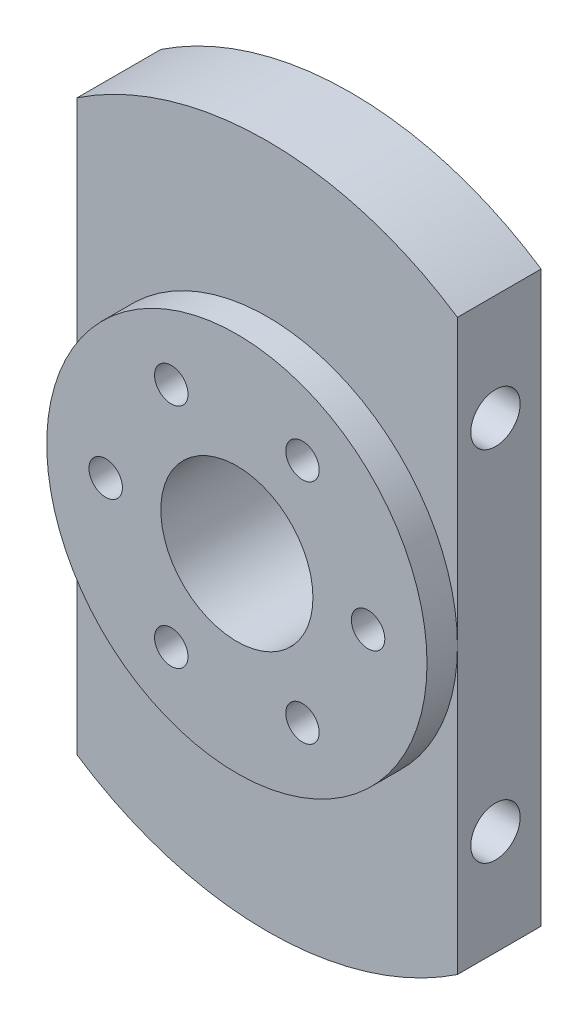
ISO-10303-21;
HEADER;
FILE_DESCRIPTION(('STEP AP214'),'2;1');
FILE_NAME('part.step','',(''),(''),'','','');
FILE_SCHEMA(('AUTOMOTIVE_DESIGN { 1 0 10303 214 1 1 1 1 }'));
ENDSEC;
DATA;
#1=APPLICATION_CONTEXT('core data for automotive mechanical design processes');
#2=APPLICATION_PROTOCOL_DEFINITION('international standard','automotive_design',2000,#1);
#3=PRODUCT_CONTEXT('',#1,'mechanical');
#4=PRODUCT('Part','Part','',(#3));
#5=PRODUCT_RELATED_PRODUCT_CATEGORY('part','',(#4));
#6=PRODUCT_DEFINITION_FORMATION('','',#4);
#7=PRODUCT_DEFINITION_CONTEXT('part definition',#1,'design');
#8=PRODUCT_DEFINITION('design','',#6,#7);
#9=PRODUCT_DEFINITION_SHAPE('','',#8);
#10=(LENGTH_UNIT() NAMED_UNIT(*) SI_UNIT(.MILLI.,.METRE.));
#11=(NAMED_UNIT(*) PLANE_ANGLE_UNIT() SI_UNIT($,.RADIAN.));
#12=(NAMED_UNIT(*) SI_UNIT($,.STERADIAN.) SOLID_ANGLE_UNIT());
#13=UNCERTAINTY_MEASURE_WITH_UNIT(LENGTH_MEASURE(1.E-05),#10,'distance_accuracy_value','');
#14=(GEOMETRIC_REPRESENTATION_CONTEXT(3) GLOBAL_UNCERTAINTY_ASSIGNED_CONTEXT((#13)) GLOBAL_UNIT_ASSIGNED_CONTEXT((#10,
#11,#12)) REPRESENTATION_CONTEXT('',''));
#15=CARTESIAN_POINT('',(0.,0.,0.));
#16=DIRECTION('',(0.,0.,1.));
#17=DIRECTION('',(1.,0.,0.));
#18=AXIS2_PLACEMENT_3D('',#15,#16,#17);
#19=CARTESIAN_POINT('',(0.,0.,15.));
#20=DIRECTION('',(0.,0.,1.));
#21=DIRECTION('',(1.,0.,0.));
#22=AXIS2_PLACEMENT_3D('',#19,#20,#21);
#23=PLANE('',#22);
#24=CARTESIAN_POINT('',(17.25,0.,15.));
#25=DIRECTION('',(0.,0.,1.));
#26=DIRECTION('',(1.,0.,0.));
#27=AXIS2_PLACEMENT_3D('',#24,#25,#26);
#28=CIRCLE('',#27,2.2);
#29=CARTESIAN_POINT('',(19.45,0.,15.));
#30=VERTEX_POINT('',#29);
#31=EDGE_CURVE('E216',#30,#30,#28,.T.);
#32=ORIENTED_EDGE('',*,*,#31,.F.);
#33=EDGE_LOOP('',(#32));
#34=FACE_BOUND('',#33,.T.);
#35=CARTESIAN_POINT('',(8.62500000000017,14.9389382152815,15.));
#36=DIRECTION('',(0.,0.,1.));
#37=DIRECTION('',(1.,0.,0.));
#38=AXIS2_PLACEMENT_3D('',#35,#36,#37);
#39=CIRCLE('',#38,2.2);
#40=CARTESIAN_POINT('',(10.8250000000002,14.9389382152815,15.));
#41=VERTEX_POINT('',#40);
#42=EDGE_CURVE('E206',#41,#41,#39,.T.);
#43=ORIENTED_EDGE('',*,*,#42,.F.);
#44=EDGE_LOOP('',(#43));
#45=FACE_BOUND('',#44,.T.);
#46=CARTESIAN_POINT('',(-8.62499999999986,14.9389382152816,15.));
#47=DIRECTION('',(0.,0.,1.));
#48=DIRECTION('',(1.,0.,0.));
#49=AXIS2_PLACEMENT_3D('',#46,#47,#48);
#50=CIRCLE('',#49,2.2);
#51=CARTESIAN_POINT('',(-6.42499999999986,14.9389382152816,15.));
#52=VERTEX_POINT('',#51);
#53=EDGE_CURVE('E225',#52,#52,#50,.T.);
#54=ORIENTED_EDGE('',*,*,#53,.F.);
#55=EDGE_LOOP('',(#54));
#56=FACE_BOUND('',#55,.T.);
#57=CARTESIAN_POINT('',(-17.25,1.20456106190088E-13,15.));
#58=DIRECTION('',(0.,0.,1.));
#59=DIRECTION('',(1.,0.,0.));
#60=AXIS2_PLACEMENT_3D('',#57,#58,#59);
#61=CIRCLE('',#60,2.2);
#62=CARTESIAN_POINT('',(-15.05,1.20456106190088E-13,15.));
#63=VERTEX_POINT('',#62);
#64=EDGE_CURVE('E233',#63,#63,#61,.T.);
#65=ORIENTED_EDGE('',*,*,#64,.F.);
#66=EDGE_LOOP('',(#65));
#67=FACE_BOUND('',#66,.T.);
#68=CARTESIAN_POINT('',(-8.62500000000007,-14.9389382152815,15.));
#69=DIRECTION('',(0.,0.,1.));
#70=DIRECTION('',(1.,0.,0.));
#71=AXIS2_PLACEMENT_3D('',#68,#69,#70);
#72=CIRCLE('',#71,2.2);
#73=CARTESIAN_POINT('',(-6.42500000000007,-14.9389382152815,15.));
#74=VERTEX_POINT('',#73);
#75=EDGE_CURVE('E229',#74,#74,#72,.T.);
#76=ORIENTED_EDGE('',*,*,#75,.F.);
#77=EDGE_LOOP('',(#76));
#78=FACE_BOUND('',#77,.T.);
#79=CARTESIAN_POINT('',(8.62499999999997,-14.9389382152816,15.));
#80=DIRECTION('',(0.,0.,1.));
#81=DIRECTION('',(1.,0.,0.));
#82=AXIS2_PLACEMENT_3D('',#79,#80,#81);
#83=CIRCLE('',#82,2.2);
#84=CARTESIAN_POINT('',(10.825,-14.9389382152816,15.));
#85=VERTEX_POINT('',#84);
#86=EDGE_CURVE('E221',#85,#85,#83,.T.);
#87=ORIENTED_EDGE('',*,*,#86,.F.);
#88=EDGE_LOOP('',(#87));
#89=FACE_BOUND('',#88,.T.);
#90=CARTESIAN_POINT('',(0.,0.,15.));
#91=DIRECTION('',(0.,0.,1.));
#92=DIRECTION('',(1.,0.,0.));
#93=AXIS2_PLACEMENT_3D('',#90,#91,#92);
#94=CIRCLE('',#93,10.);
#95=CARTESIAN_POINT('',(10.,0.,15.));
#96=VERTEX_POINT('',#95);
#97=EDGE_CURVE('E220',#96,#96,#94,.T.);
#98=ORIENTED_EDGE('',*,*,#97,.F.);
#99=EDGE_LOOP('',(#98));
#100=FACE_BOUND('',#99,.T.);
#101=CARTESIAN_POINT('',(0.,0.,15.));
#102=DIRECTION('',(0.,0.,1.));
#103=DIRECTION('',(1.,0.,0.));
#104=AXIS2_PLACEMENT_3D('',#101,#102,#103);
#105=CIRCLE('',#104,25.);
#106=CARTESIAN_POINT('',(25.,0.,15.));
#107=VERTEX_POINT('',#106);
#108=EDGE_CURVE('E120',#107,#107,#105,.T.);
#109=ORIENTED_EDGE('',*,*,#108,.T.);
#110=EDGE_LOOP('',(#109));
#111=FACE_BOUND('',#110,.T.);
#112=ADVANCED_FACE('F43',(#34,#45,#56,#67,#78,#89,#100,#111),#23,.T.);
#113=CARTESIAN_POINT('',(25.,0.,0.));
#114=DIRECTION('',(1.,0.,0.));
#115=DIRECTION('',(0.,0.,-1.));
#116=AXIS2_PLACEMENT_3D('',#113,#114,#115);
#117=PLANE('',#116);
#118=CARTESIAN_POINT('',(25.,23.45,6.00000000000001));
#119=DIRECTION('',(1.,0.,0.));
#120=DIRECTION('',(0.,0.,-1.));
#121=AXIS2_PLACEMENT_3D('',#118,#119,#120);
#122=CIRCLE('',#121,3.25);
#123=CARTESIAN_POINT('',(25.,23.45,2.75000000000001));
#124=VERTEX_POINT('',#123);
#125=EDGE_CURVE('E186',#124,#124,#122,.T.);
#126=ORIENTED_EDGE('',*,*,#125,.F.);
#127=EDGE_LOOP('',(#126));
#128=FACE_BOUND('',#127,.T.);
#129=CARTESIAN_POINT('',(25.,-23.63,6.));
#130=DIRECTION('',(1.,0.,0.));
#131=DIRECTION('',(0.,0.,-1.));
#132=AXIS2_PLACEMENT_3D('',#129,#130,#131);
#133=CIRCLE('',#132,3.25);
#134=CARTESIAN_POINT('',(25.,-23.63,2.75));
#135=VERTEX_POINT('',#134);
#136=EDGE_CURVE('E190',#135,#135,#133,.T.);
#137=ORIENTED_EDGE('',*,*,#136,.F.);
#138=EDGE_LOOP('',(#137));
#139=FACE_BOUND('',#138,.T.);
#140=DIRECTION('',(0.,1.,0.));
#141=VECTOR('',#140,1.);
#142=CARTESIAN_POINT('',(25.,0.,11.));
#143=LINE('',#142,#141);
#144=CARTESIAN_POINT('',(25.,0.,11.));
#145=VERTEX_POINT('',#144);
#146=CARTESIAN_POINT('',(25.,37.4165738677394,11.));
#147=VERTEX_POINT('',#146);
#148=EDGE_CURVE('E119',#145,#147,#143,.T.);
#149=ORIENTED_EDGE('',*,*,#148,.F.);
#150=DIRECTION('',(0.,1.,0.));
#151=VECTOR('',#150,1.);
#152=CARTESIAN_POINT('',(25.,0.,11.));
#153=LINE('',#152,#151);
#154=CARTESIAN_POINT('',(25.,-37.4165738677394,11.));
#155=VERTEX_POINT('',#154);
#156=EDGE_CURVE('E99',#155,#145,#153,.T.);
#157=ORIENTED_EDGE('',*,*,#156,.F.);
#158=DIRECTION('',(0.,0.,1.));
#159=VECTOR('',#158,1.);
#160=CARTESIAN_POINT('',(25.,-37.4165738677394,0.));
#161=LINE('',#160,#159);
#162=CARTESIAN_POINT('',(25.,-37.4165738677394,0.));
#163=VERTEX_POINT('',#162);
#164=EDGE_CURVE('E69',#163,#155,#161,.T.);
#165=ORIENTED_EDGE('',*,*,#164,.F.);
#166=DIRECTION('',(0.,1.,0.));
#167=VECTOR('',#166,1.);
#168=CARTESIAN_POINT('',(25.,0.,0.));
#169=LINE('',#168,#167);
#170=CARTESIAN_POINT('',(25.,37.4165738677394,0.));
#171=VERTEX_POINT('',#170);
#172=EDGE_CURVE('E185',#163,#171,#169,.T.);
#173=ORIENTED_EDGE('',*,*,#172,.T.);
#174=DIRECTION('',(0.,0.,1.));
#175=VECTOR('',#174,1.);
#176=CARTESIAN_POINT('',(25.,37.4165738677394,0.));
#177=LINE('',#176,#175);
#178=EDGE_CURVE('E202',#171,#147,#177,.T.);
#179=ORIENTED_EDGE('',*,*,#178,.T.);
#180=EDGE_LOOP('',(#149,#157,#165,#173,#179));
#181=FACE_BOUND('',#180,.T.);
#182=ADVANCED_FACE('F288',(#128,#139,#181),#117,.T.);
#183=CARTESIAN_POINT('',(-25.,0.,0.));
#184=DIRECTION('',(1.,0.,0.));
#185=DIRECTION('',(0.,0.,-1.));
#186=AXIS2_PLACEMENT_3D('',#183,#184,#185);
#187=PLANE('',#186);
#188=CARTESIAN_POINT('',(-25.,23.45,6.00000000000001));
#189=DIRECTION('',(1.,0.,0.));
#190=DIRECTION('',(0.,0.,-1.));
#191=AXIS2_PLACEMENT_3D('',#188,#189,#190);
#192=CIRCLE('',#191,3.25);
#193=CARTESIAN_POINT('',(-25.,23.45,2.75000000000001));
#194=VERTEX_POINT('',#193);
#195=EDGE_CURVE('E181',#194,#194,#192,.T.);
#196=ORIENTED_EDGE('',*,*,#195,.T.);
#197=EDGE_LOOP('',(#196));
#198=FACE_BOUND('',#197,.T.);
#199=CARTESIAN_POINT('',(-25.,-23.63,6.));
#200=DIRECTION('',(1.,0.,0.));
#201=DIRECTION('',(0.,0.,-1.));
#202=AXIS2_PLACEMENT_3D('',#199,#200,#201);
#203=CIRCLE('',#202,3.25);
#204=CARTESIAN_POINT('',(-25.,-23.63,2.75));
#205=VERTEX_POINT('',#204);
#206=EDGE_CURVE('E194',#205,#205,#203,.T.);
#207=ORIENTED_EDGE('',*,*,#206,.T.);
#208=EDGE_LOOP('',(#207));
#209=FACE_BOUND('',#208,.T.);
#210=DIRECTION('',(0.,-1.,0.));
#211=VECTOR('',#210,1.);
#212=CARTESIAN_POINT('',(-25.,0.,11.));
#213=LINE('',#212,#211);
#214=CARTESIAN_POINT('',(-25.,0.,11.));
#215=VERTEX_POINT('',#214);
#216=CARTESIAN_POINT('',(-25.,-37.4165738677394,11.));
#217=VERTEX_POINT('',#216);
#218=EDGE_CURVE('E97',#215,#217,#213,.T.);
#219=ORIENTED_EDGE('',*,*,#218,.F.);
#220=DIRECTION('',(0.,-1.,0.));
#221=VECTOR('',#220,1.);
#222=CARTESIAN_POINT('',(-25.,0.,11.));
#223=LINE('',#222,#221);
#224=CARTESIAN_POINT('',(-25.,37.4165738677394,11.));
#225=VERTEX_POINT('',#224);
#226=EDGE_CURVE('E108',#225,#215,#223,.T.);
#227=ORIENTED_EDGE('',*,*,#226,.F.);
#228=DIRECTION('',(0.,0.,1.));
#229=VECTOR('',#228,1.);
#230=CARTESIAN_POINT('',(-25.,37.4165738677394,0.));
#231=LINE('',#230,#229);
#232=CARTESIAN_POINT('',(-25.,37.4165738677394,0.));
#233=VERTEX_POINT('',#232);
#234=EDGE_CURVE('E203',#233,#225,#231,.T.);
#235=ORIENTED_EDGE('',*,*,#234,.F.);
#236=DIRECTION('',(0.,1.,0.));
#237=VECTOR('',#236,1.);
#238=CARTESIAN_POINT('',(-25.,0.,0.));
#239=LINE('',#238,#237);
#240=CARTESIAN_POINT('',(-25.,-37.4165738677394,0.));
#241=VERTEX_POINT('',#240);
#242=EDGE_CURVE('E198',#241,#233,#239,.T.);
#243=ORIENTED_EDGE('',*,*,#242,.F.);
#244=DIRECTION('',(0.,0.,1.));
#245=VECTOR('',#244,1.);
#246=CARTESIAN_POINT('',(-25.,-37.4165738677394,0.));
#247=LINE('',#246,#245);
#248=EDGE_CURVE('E111',#241,#217,#247,.T.);
#249=ORIENTED_EDGE('',*,*,#248,.T.);
#250=EDGE_LOOP('',(#219,#227,#235,#243,#249));
#251=FACE_BOUND('',#250,.T.);
#252=ADVANCED_FACE('F107',(#198,#209,#251),#187,.F.);
#253=CARTESIAN_POINT('',(0.,0.,15.));
#254=DIRECTION('',(0.,0.,-1.));
#255=DIRECTION('',(-1.,0.,0.));
#256=AXIS2_PLACEMENT_3D('',#253,#254,#255);
#257=CYLINDRICAL_SURFACE('',#256,45.);
#258=CARTESIAN_POINT('',(0.,0.,11.));
#259=DIRECTION('',(0.,0.,1.));
#260=DIRECTION('',(1.,0.,0.));
#261=AXIS2_PLACEMENT_3D('',#258,#259,#260);
#262=CIRCLE('',#261,45.);
#263=EDGE_CURVE('E113',#217,#155,#262,.T.);
#264=ORIENTED_EDGE('',*,*,#263,.F.);
#265=ORIENTED_EDGE('',*,*,#248,.F.);
#266=CARTESIAN_POINT('',(0.,0.,0.));
#267=DIRECTION('',(0.,0.,1.));
#268=DIRECTION('',(1.,0.,0.));
#269=AXIS2_PLACEMENT_3D('',#266,#267,#268);
#270=CIRCLE('',#269,45.);
#271=EDGE_CURVE('E53',#241,#163,#270,.T.);
#272=ORIENTED_EDGE('',*,*,#271,.T.);
#273=ORIENTED_EDGE('',*,*,#164,.T.);
#274=EDGE_LOOP('',(#264,#265,#272,#273));
#275=FACE_BOUND('',#274,.T.);
#276=ADVANCED_FACE('F45',(#275),#257,.T.);
#277=CARTESIAN_POINT('',(0.,0.,11.));
#278=DIRECTION('',(0.,0.,1.));
#279=DIRECTION('',(1.,0.,0.));
#280=AXIS2_PLACEMENT_3D('',#277,#278,#279);
#281=CIRCLE('',#280,45.);
#282=EDGE_CURVE('E61',#147,#225,#281,.T.);
#283=ORIENTED_EDGE('',*,*,#282,.F.);
#284=ORIENTED_EDGE('',*,*,#178,.F.);
#285=EDGE_CURVE('E11',#171,#233,#270,.T.);
#286=ORIENTED_EDGE('',*,*,#285,.T.);
#287=ORIENTED_EDGE('',*,*,#234,.T.);
#288=EDGE_LOOP('',(#283,#284,#286,#287));
#289=FACE_BOUND('',#288,.T.);
#290=ADVANCED_FACE('F275',(#289),#257,.T.);
#291=CARTESIAN_POINT('',(8.62499999999997,-14.9389382152816,0.));
#292=DIRECTION('',(0.,0.,1.));
#293=DIRECTION('',(1.,0.,0.));
#294=AXIS2_PLACEMENT_3D('',#291,#292,#293);
#295=CYLINDRICAL_SURFACE('',#294,2.2);
#296=ORIENTED_EDGE('',*,*,#86,.T.);
#297=EDGE_LOOP('',(#296));
#298=FACE_BOUND('',#297,.T.);
#299=CARTESIAN_POINT('',(8.62499999999997,-14.9389382152816,9.));
#300=DIRECTION('',(0.,0.,-1.));
#301=DIRECTION('',(-1.,0.,0.));
#302=AXIS2_PLACEMENT_3D('',#299,#300,#301);
#303=CIRCLE('',#302,2.2);
#304=CARTESIAN_POINT('',(6.42499999999997,-14.9389382152816,9.));
#305=VERTEX_POINT('',#304);
#306=EDGE_CURVE('E47',#305,#305,#303,.F.);
#307=ORIENTED_EDGE('',*,*,#306,.F.);
#308=EDGE_LOOP('',(#307));
#309=FACE_BOUND('',#308,.T.);
#310=ADVANCED_FACE('F272',(#298,#309),#295,.F.);
#311=CARTESIAN_POINT('',(-8.62500000000007,-14.9389382152815,0.));
#312=DIRECTION('',(0.,0.,1.));
#313=DIRECTION('',(1.,0.,0.));
#314=AXIS2_PLACEMENT_3D('',#311,#312,#313);
#315=CYLINDRICAL_SURFACE('',#314,2.2);
#316=ORIENTED_EDGE('',*,*,#75,.T.);
#317=EDGE_LOOP('',(#316));
#318=FACE_BOUND('',#317,.T.);
#319=CARTESIAN_POINT('',(-8.62500000000007,-14.9389382152815,9.));
#320=DIRECTION('',(0.,0.,-1.));
#321=DIRECTION('',(-1.,0.,0.));
#322=AXIS2_PLACEMENT_3D('',#319,#320,#321);
#323=CIRCLE('',#322,2.2);
#324=CARTESIAN_POINT('',(-10.8250000000001,-14.9389382152815,9.));
#325=VERTEX_POINT('',#324);
#326=EDGE_CURVE('E261',#325,#325,#323,.F.);
#327=ORIENTED_EDGE('',*,*,#326,.F.);
#328=EDGE_LOOP('',(#327));
#329=FACE_BOUND('',#328,.T.);
#330=ADVANCED_FACE('F274',(#318,#329),#315,.F.);
#331=CARTESIAN_POINT('',(-17.25,1.20456106190088E-13,0.));
#332=DIRECTION('',(0.,0.,1.));
#333=DIRECTION('',(1.,0.,0.));
#334=AXIS2_PLACEMENT_3D('',#331,#332,#333);
#335=CYLINDRICAL_SURFACE('',#334,2.2);
#336=ORIENTED_EDGE('',*,*,#64,.T.);
#337=EDGE_LOOP('',(#336));
#338=FACE_BOUND('',#337,.T.);
#339=CARTESIAN_POINT('',(-17.25,1.20456106190088E-13,9.));
#340=DIRECTION('',(0.,0.,-1.));
#341=DIRECTION('',(-1.,0.,0.));
#342=AXIS2_PLACEMENT_3D('',#339,#340,#341);
#343=CIRCLE('',#342,2.2);
#344=CARTESIAN_POINT('',(-19.45,1.20456106190088E-13,9.));
#345=VERTEX_POINT('',#344);
#346=EDGE_CURVE('E258',#345,#345,#343,.F.);
#347=ORIENTED_EDGE('',*,*,#346,.F.);
#348=EDGE_LOOP('',(#347));
#349=FACE_BOUND('',#348,.T.);
#350=ADVANCED_FACE('F282',(#338,#349),#335,.F.);
#351=CARTESIAN_POINT('',(-8.62499999999986,14.9389382152816,0.));
#352=DIRECTION('',(0.,0.,1.));
#353=DIRECTION('',(1.,0.,0.));
#354=AXIS2_PLACEMENT_3D('',#351,#352,#353);
#355=CYLINDRICAL_SURFACE('',#354,2.2);
#356=ORIENTED_EDGE('',*,*,#53,.T.);
#357=EDGE_LOOP('',(#356));
#358=FACE_BOUND('',#357,.T.);
#359=CARTESIAN_POINT('',(-8.62499999999986,14.9389382152816,9.));
#360=DIRECTION('',(0.,0.,-1.));
#361=DIRECTION('',(-1.,0.,0.));
#362=AXIS2_PLACEMENT_3D('',#359,#360,#361);
#363=CIRCLE('',#362,2.2);
#364=CARTESIAN_POINT('',(-10.8249999999999,14.9389382152816,9.));
#365=VERTEX_POINT('',#364);
#366=EDGE_CURVE('E254',#365,#365,#363,.F.);
#367=ORIENTED_EDGE('',*,*,#366,.F.);
#368=EDGE_LOOP('',(#367));
#369=FACE_BOUND('',#368,.T.);
#370=ADVANCED_FACE('F351',(#358,#369),#355,.F.);
#371=CARTESIAN_POINT('',(8.62500000000017,14.9389382152815,0.));
#372=DIRECTION('',(0.,0.,1.));
#373=DIRECTION('',(1.,0.,0.));
#374=AXIS2_PLACEMENT_3D('',#371,#372,#373);
#375=CYLINDRICAL_SURFACE('',#374,2.2);
#376=ORIENTED_EDGE('',*,*,#42,.T.);
#377=EDGE_LOOP('',(#376));
#378=FACE_BOUND('',#377,.T.);
#379=CARTESIAN_POINT('',(8.62500000000017,14.9389382152815,9.));
#380=DIRECTION('',(0.,0.,-1.));
#381=DIRECTION('',(-1.,0.,0.));
#382=AXIS2_PLACEMENT_3D('',#379,#380,#381);
#383=CIRCLE('',#382,2.2);
#384=CARTESIAN_POINT('',(6.42500000000017,14.9389382152815,9.));
#385=VERTEX_POINT('',#384);
#386=EDGE_CURVE('E250',#385,#385,#383,.F.);
#387=ORIENTED_EDGE('',*,*,#386,.F.);
#388=EDGE_LOOP('',(#387));
#389=FACE_BOUND('',#388,.T.);
#390=ADVANCED_FACE('F311',(#378,#389),#375,.F.);
#391=CARTESIAN_POINT('',(17.25,0.,0.));
#392=DIRECTION('',(0.,0.,1.));
#393=DIRECTION('',(1.,0.,0.));
#394=AXIS2_PLACEMENT_3D('',#391,#392,#393);
#395=CYLINDRICAL_SURFACE('',#394,2.2);
#396=ORIENTED_EDGE('',*,*,#31,.T.);
#397=EDGE_LOOP('',(#396));
#398=FACE_BOUND('',#397,.T.);
#399=CARTESIAN_POINT('',(17.25,0.,9.));
#400=DIRECTION('',(0.,0.,-1.));
#401=DIRECTION('',(-1.,0.,0.));
#402=AXIS2_PLACEMENT_3D('',#399,#400,#401);
#403=CIRCLE('',#402,2.2);
#404=CARTESIAN_POINT('',(15.05,0.,9.));
#405=VERTEX_POINT('',#404);
#406=EDGE_CURVE('E141',#405,#405,#403,.F.);
#407=ORIENTED_EDGE('',*,*,#406,.F.);
#408=EDGE_LOOP('',(#407));
#409=FACE_BOUND('',#408,.T.);
#410=ADVANCED_FACE('F303',(#398,#409),#395,.F.);
#411=CARTESIAN_POINT('',(0.,0.,0.));
#412=DIRECTION('',(0.,0.,1.));
#413=DIRECTION('',(1.,0.,0.));
#414=AXIS2_PLACEMENT_3D('',#411,#412,#413);
#415=PLANE('',#414);
#416=CARTESIAN_POINT('',(17.25,0.,0.));
#417=DIRECTION('',(0.,0.,-1.));
#418=DIRECTION('',(-1.,0.,0.));
#419=AXIS2_PLACEMENT_3D('',#416,#417,#418);
#420=CIRCLE('',#419,4.);
#421=CARTESIAN_POINT('',(13.25,0.,0.));
#422=VERTEX_POINT('',#421);
#423=EDGE_CURVE('E142',#422,#422,#420,.T.);
#424=ORIENTED_EDGE('',*,*,#423,.F.);
#425=EDGE_LOOP('',(#424));
#426=FACE_BOUND('',#425,.T.);
#427=CARTESIAN_POINT('',(-8.62499999999986,14.9389382152816,0.));
#428=DIRECTION('',(0.,0.,-1.));
#429=DIRECTION('',(-1.,0.,0.));
#430=AXIS2_PLACEMENT_3D('',#427,#428,#429);
#431=CIRCLE('',#430,4.);
#432=CARTESIAN_POINT('',(-12.6249999999999,14.9389382152816,0.));
#433=VERTEX_POINT('',#432);
#434=EDGE_CURVE('E129',#433,#433,#431,.T.);
#435=ORIENTED_EDGE('',*,*,#434,.F.);
#436=EDGE_LOOP('',(#435));
#437=FACE_BOUND('',#436,.T.);
#438=CARTESIAN_POINT('',(-17.25,1.20456106190088E-13,0.));
#439=DIRECTION('',(0.,0.,-1.));
#440=DIRECTION('',(-1.,0.,0.));
#441=AXIS2_PLACEMENT_3D('',#438,#439,#440);
#442=CIRCLE('',#441,4.);
#443=CARTESIAN_POINT('',(-21.25,1.20456106190088E-13,0.));
#444=VERTEX_POINT('',#443);
#445=EDGE_CURVE('E174',#444,#444,#442,.T.);
#446=ORIENTED_EDGE('',*,*,#445,.F.);
#447=EDGE_LOOP('',(#446));
#448=FACE_BOUND('',#447,.T.);
#449=CARTESIAN_POINT('',(-8.62500000000007,-14.9389382152815,0.));
#450=DIRECTION('',(0.,0.,-1.));
#451=DIRECTION('',(-1.,0.,0.));
#452=AXIS2_PLACEMENT_3D('',#449,#450,#451);
#453=CIRCLE('',#452,4.);
#454=CARTESIAN_POINT('',(-12.6250000000001,-14.9389382152815,0.));
#455=VERTEX_POINT('',#454);
#456=EDGE_CURVE('E166',#455,#455,#453,.T.);
#457=ORIENTED_EDGE('',*,*,#456,.F.);
#458=EDGE_LOOP('',(#457));
#459=FACE_BOUND('',#458,.T.);
#460=CARTESIAN_POINT('',(8.62499999999997,-14.9389382152816,0.));
#461=DIRECTION('',(0.,0.,-1.));
#462=DIRECTION('',(-1.,0.,0.));
#463=AXIS2_PLACEMENT_3D('',#460,#461,#462);
#464=CIRCLE('',#463,4.);
#465=CARTESIAN_POINT('',(4.62499999999997,-14.9389382152816,0.));
#466=VERTEX_POINT('',#465);
#467=EDGE_CURVE('E158',#466,#466,#464,.T.);
#468=ORIENTED_EDGE('',*,*,#467,.F.);
#469=EDGE_LOOP('',(#468));
#470=FACE_BOUND('',#469,.T.);
#471=CARTESIAN_POINT('',(8.62500000000017,14.9389382152815,0.));
#472=DIRECTION('',(0.,0.,-1.));
#473=DIRECTION('',(-1.,0.,0.));
#474=AXIS2_PLACEMENT_3D('',#471,#472,#473);
#475=CIRCLE('',#474,4.);
#476=CARTESIAN_POINT('',(4.62500000000017,14.9389382152815,0.));
#477=VERTEX_POINT('',#476);
#478=EDGE_CURVE('E146',#477,#477,#475,.T.);
#479=ORIENTED_EDGE('',*,*,#478,.F.);
#480=EDGE_LOOP('',(#479));
#481=FACE_BOUND('',#480,.T.);
#482=CARTESIAN_POINT('',(0.,0.,0.));
#483=DIRECTION('',(0.,0.,1.));
#484=DIRECTION('',(1.,0.,0.));
#485=AXIS2_PLACEMENT_3D('',#482,#483,#484);
#486=CIRCLE('',#485,10.);
#487=CARTESIAN_POINT('',(10.,0.,0.));
#488=VERTEX_POINT('',#487);
#489=EDGE_CURVE('E242',#488,#488,#486,.T.);
#490=ORIENTED_EDGE('',*,*,#489,.T.);
#491=EDGE_LOOP('',(#490));
#492=FACE_BOUND('',#491,.T.);
#493=ORIENTED_EDGE('',*,*,#271,.F.);
#494=ORIENTED_EDGE('',*,*,#242,.T.);
#495=ORIENTED_EDGE('',*,*,#285,.F.);
#496=ORIENTED_EDGE('',*,*,#172,.F.);
#497=EDGE_LOOP('',(#493,#494,#495,#496));
#498=FACE_BOUND('',#497,.T.);
#499=ADVANCED_FACE('F301',(#426,#437,#448,#459,#470,#481,#492,#498),#415,.F.);
#500=CARTESIAN_POINT('',(0.,0.,-11.));
#501=DIRECTION('',(0.,0.,1.));
#502=DIRECTION('',(1.,0.,0.));
#503=AXIS2_PLACEMENT_3D('',#500,#501,#502);
#504=CYLINDRICAL_SURFACE('',#503,10.);
#505=ORIENTED_EDGE('',*,*,#97,.T.);
#506=EDGE_LOOP('',(#505));
#507=FACE_BOUND('',#506,.T.);
#508=ORIENTED_EDGE('',*,*,#489,.F.);
#509=EDGE_LOOP('',(#508));
#510=FACE_BOUND('',#509,.T.);
#511=ADVANCED_FACE('F299',(#507,#510),#504,.F.);
#512=CARTESIAN_POINT('',(-25.,-23.63,6.));
#513=DIRECTION('',(1.,0.,0.));
#514=DIRECTION('',(0.,0.,-1.));
#515=AXIS2_PLACEMENT_3D('',#512,#513,#514);
#516=CYLINDRICAL_SURFACE('',#515,3.25);
#517=ORIENTED_EDGE('',*,*,#206,.F.);
#518=EDGE_LOOP('',(#517));
#519=FACE_BOUND('',#518,.T.);
#520=ORIENTED_EDGE('',*,*,#136,.T.);
#521=EDGE_LOOP('',(#520));
#522=FACE_BOUND('',#521,.T.);
#523=ADVANCED_FACE('F309',(#519,#522),#516,.F.);
#524=CARTESIAN_POINT('',(-25.,23.45,6.00000000000001));
#525=DIRECTION('',(1.,0.,0.));
#526=DIRECTION('',(0.,0.,-1.));
#527=AXIS2_PLACEMENT_3D('',#524,#525,#526);
#528=CYLINDRICAL_SURFACE('',#527,3.25);
#529=ORIENTED_EDGE('',*,*,#195,.F.);
#530=EDGE_LOOP('',(#529));
#531=FACE_BOUND('',#530,.T.);
#532=ORIENTED_EDGE('',*,*,#125,.T.);
#533=EDGE_LOOP('',(#532));
#534=FACE_BOUND('',#533,.T.);
#535=ADVANCED_FACE('F402',(#531,#534),#528,.F.);
#536=CARTESIAN_POINT('',(17.25,0.,9.));
#537=DIRECTION('',(0.,0.,-1.));
#538=DIRECTION('',(-1.,0.,0.));
#539=AXIS2_PLACEMENT_3D('',#536,#537,#538);
#540=PLANE('',#539);
#541=CARTESIAN_POINT('',(17.25,0.,9.));
#542=DIRECTION('',(0.,0.,-1.));
#543=DIRECTION('',(-1.,0.,0.));
#544=AXIS2_PLACEMENT_3D('',#541,#542,#543);
#545=CIRCLE('',#544,4.);
#546=CARTESIAN_POINT('',(13.25,0.,9.));
#547=VERTEX_POINT('',#546);
#548=EDGE_CURVE('E137',#547,#547,#545,.T.);
#549=ORIENTED_EDGE('',*,*,#548,.T.);
#550=EDGE_LOOP('',(#549));
#551=FACE_BOUND('',#550,.T.);
#552=ORIENTED_EDGE('',*,*,#406,.T.);
#553=EDGE_LOOP('',(#552));
#554=FACE_BOUND('',#553,.T.);
#555=ADVANCED_FACE('F374',(#551,#554),#540,.T.);
#556=CARTESIAN_POINT('',(17.25,0.,9.));
#557=DIRECTION('',(0.,0.,-1.));
#558=DIRECTION('',(-1.,0.,0.));
#559=AXIS2_PLACEMENT_3D('',#556,#557,#558);
#560=CYLINDRICAL_SURFACE('',#559,4.);
#561=ORIENTED_EDGE('',*,*,#548,.F.);
#562=EDGE_LOOP('',(#561));
#563=FACE_BOUND('',#562,.T.);
#564=ORIENTED_EDGE('',*,*,#423,.T.);
#565=EDGE_LOOP('',(#564));
#566=FACE_BOUND('',#565,.T.);
#567=ADVANCED_FACE('F364',(#563,#566),#560,.F.);
#568=CARTESIAN_POINT('',(8.62500000000017,14.9389382152815,9.));
#569=DIRECTION('',(0.,0.,-1.));
#570=DIRECTION('',(-1.,0.,0.));
#571=AXIS2_PLACEMENT_3D('',#568,#569,#570);
#572=PLANE('',#571);
#573=CARTESIAN_POINT('',(8.62500000000017,14.9389382152815,9.));
#574=DIRECTION('',(0.,0.,-1.));
#575=DIRECTION('',(-1.,0.,0.));
#576=AXIS2_PLACEMENT_3D('',#573,#574,#575);
#577=CIRCLE('',#576,4.);
#578=CARTESIAN_POINT('',(4.62500000000017,14.9389382152815,9.));
#579=VERTEX_POINT('',#578);
#580=EDGE_CURVE('E154',#579,#579,#577,.T.);
#581=ORIENTED_EDGE('',*,*,#580,.T.);
#582=EDGE_LOOP('',(#581));
#583=FACE_BOUND('',#582,.T.);
#584=ORIENTED_EDGE('',*,*,#386,.T.);
#585=EDGE_LOOP('',(#584));
#586=FACE_BOUND('',#585,.T.);
#587=ADVANCED_FACE('F361',(#583,#586),#572,.T.);
#588=CARTESIAN_POINT('',(8.62500000000017,14.9389382152815,9.));
#589=DIRECTION('',(0.,0.,-1.));
#590=DIRECTION('',(-1.,0.,0.));
#591=AXIS2_PLACEMENT_3D('',#588,#589,#590);
#592=CYLINDRICAL_SURFACE('',#591,4.);
#593=ORIENTED_EDGE('',*,*,#580,.F.);
#594=EDGE_LOOP('',(#593));
#595=FACE_BOUND('',#594,.T.);
#596=ORIENTED_EDGE('',*,*,#478,.T.);
#597=EDGE_LOOP('',(#596));
#598=FACE_BOUND('',#597,.T.);
#599=ADVANCED_FACE('F363',(#595,#598),#592,.F.);
#600=CARTESIAN_POINT('',(-8.62499999999986,14.9389382152816,9.));
#601=DIRECTION('',(0.,0.,-1.));
#602=DIRECTION('',(-1.,0.,0.));
#603=AXIS2_PLACEMENT_3D('',#600,#601,#602);
#604=PLANE('',#603);
#605=CARTESIAN_POINT('',(-8.62499999999986,14.9389382152816,9.));
#606=DIRECTION('',(0.,0.,-1.));
#607=DIRECTION('',(-1.,0.,0.));
#608=AXIS2_PLACEMENT_3D('',#605,#606,#607);
#609=CIRCLE('',#608,4.);
#610=CARTESIAN_POINT('',(-12.6249999999999,14.9389382152816,9.));
#611=VERTEX_POINT('',#610);
#612=EDGE_CURVE('E124',#611,#611,#609,.T.);
#613=ORIENTED_EDGE('',*,*,#612,.T.);
#614=EDGE_LOOP('',(#613));
#615=FACE_BOUND('',#614,.T.);
#616=ORIENTED_EDGE('',*,*,#366,.T.);
#617=EDGE_LOOP('',(#616));
#618=FACE_BOUND('',#617,.T.);
#619=ADVANCED_FACE('F371',(#615,#618),#604,.T.);
#620=CARTESIAN_POINT('',(-8.62499999999986,14.9389382152816,9.));
#621=DIRECTION('',(0.,0.,-1.));
#622=DIRECTION('',(-1.,0.,0.));
#623=AXIS2_PLACEMENT_3D('',#620,#621,#622);
#624=CYLINDRICAL_SURFACE('',#623,4.);
#625=ORIENTED_EDGE('',*,*,#612,.F.);
#626=EDGE_LOOP('',(#625));
#627=FACE_BOUND('',#626,.T.);
#628=ORIENTED_EDGE('',*,*,#434,.T.);
#629=EDGE_LOOP('',(#628));
#630=FACE_BOUND('',#629,.T.);
#631=ADVANCED_FACE('F400',(#627,#630),#624,.F.);
#632=CARTESIAN_POINT('',(-17.25,1.20456106190088E-13,9.));
#633=DIRECTION('',(0.,0.,-1.));
#634=DIRECTION('',(-1.,0.,0.));
#635=AXIS2_PLACEMENT_3D('',#632,#633,#634);
#636=PLANE('',#635);
#637=CARTESIAN_POINT('',(-17.25,1.20456106190088E-13,9.));
#638=DIRECTION('',(0.,0.,-1.));
#639=DIRECTION('',(-1.,0.,0.));
#640=AXIS2_PLACEMENT_3D('',#637,#638,#639);
#641=CIRCLE('',#640,4.);
#642=CARTESIAN_POINT('',(-21.25,1.20456106190088E-13,9.));
#643=VERTEX_POINT('',#642);
#644=EDGE_CURVE('E149',#643,#643,#641,.T.);
#645=ORIENTED_EDGE('',*,*,#644,.T.);
#646=EDGE_LOOP('',(#645));
#647=FACE_BOUND('',#646,.T.);
#648=ORIENTED_EDGE('',*,*,#346,.T.);
#649=EDGE_LOOP('',(#648));
#650=FACE_BOUND('',#649,.T.);
#651=ADVANCED_FACE('F397',(#647,#650),#636,.T.);
#652=CARTESIAN_POINT('',(-17.25,1.20456106190088E-13,9.));
#653=DIRECTION('',(0.,0.,-1.));
#654=DIRECTION('',(-1.,0.,0.));
#655=AXIS2_PLACEMENT_3D('',#652,#653,#654);
#656=CYLINDRICAL_SURFACE('',#655,4.);
#657=ORIENTED_EDGE('',*,*,#644,.F.);
#658=EDGE_LOOP('',(#657));
#659=FACE_BOUND('',#658,.T.);
#660=ORIENTED_EDGE('',*,*,#445,.T.);
#661=EDGE_LOOP('',(#660));
#662=FACE_BOUND('',#661,.T.);
#663=ADVANCED_FACE('F393',(#659,#662),#656,.F.);
#664=CARTESIAN_POINT('',(-8.62500000000007,-14.9389382152815,9.));
#665=DIRECTION('',(0.,0.,-1.));
#666=DIRECTION('',(-1.,0.,0.));
#667=AXIS2_PLACEMENT_3D('',#664,#665,#666);
#668=PLANE('',#667);
#669=CARTESIAN_POINT('',(-8.62500000000007,-14.9389382152815,9.));
#670=DIRECTION('',(0.,0.,-1.));
#671=DIRECTION('',(-1.,0.,0.));
#672=AXIS2_PLACEMENT_3D('',#669,#670,#671);
#673=CIRCLE('',#672,4.);
#674=CARTESIAN_POINT('',(-12.6250000000001,-14.9389382152815,9.));
#675=VERTEX_POINT('',#674);
#676=EDGE_CURVE('E170',#675,#675,#673,.T.);
#677=ORIENTED_EDGE('',*,*,#676,.T.);
#678=EDGE_LOOP('',(#677));
#679=FACE_BOUND('',#678,.T.);
#680=ORIENTED_EDGE('',*,*,#326,.T.);
#681=EDGE_LOOP('',(#680));
#682=FACE_BOUND('',#681,.T.);
#683=ADVANCED_FACE('F389',(#679,#682),#668,.T.);
#684=CARTESIAN_POINT('',(-8.62500000000007,-14.9389382152815,9.));
#685=DIRECTION('',(0.,0.,-1.));
#686=DIRECTION('',(-1.,0.,0.));
#687=AXIS2_PLACEMENT_3D('',#684,#685,#686);
#688=CYLINDRICAL_SURFACE('',#687,4.);
#689=ORIENTED_EDGE('',*,*,#676,.F.);
#690=EDGE_LOOP('',(#689));
#691=FACE_BOUND('',#690,.T.);
#692=ORIENTED_EDGE('',*,*,#456,.T.);
#693=EDGE_LOOP('',(#692));
#694=FACE_BOUND('',#693,.T.);
#695=ADVANCED_FACE('F385',(#691,#694),#688,.F.);
#696=CARTESIAN_POINT('',(8.62499999999997,-14.9389382152816,9.));
#697=DIRECTION('',(0.,0.,-1.));
#698=DIRECTION('',(-1.,0.,0.));
#699=AXIS2_PLACEMENT_3D('',#696,#697,#698);
#700=PLANE('',#699);
#701=CARTESIAN_POINT('',(8.62499999999997,-14.9389382152816,9.));
#702=DIRECTION('',(0.,0.,-1.));
#703=DIRECTION('',(-1.,0.,0.));
#704=AXIS2_PLACEMENT_3D('',#701,#702,#703);
#705=CIRCLE('',#704,4.);
#706=CARTESIAN_POINT('',(4.62499999999997,-14.9389382152816,9.));
#707=VERTEX_POINT('',#706);
#708=EDGE_CURVE('E162',#707,#707,#705,.T.);
#709=ORIENTED_EDGE('',*,*,#708,.T.);
#710=EDGE_LOOP('',(#709));
#711=FACE_BOUND('',#710,.T.);
#712=ORIENTED_EDGE('',*,*,#306,.T.);
#713=EDGE_LOOP('',(#712));
#714=FACE_BOUND('',#713,.T.);
#715=ADVANCED_FACE('F270',(#711,#714),#700,.T.);
#716=CARTESIAN_POINT('',(8.62499999999997,-14.9389382152816,9.));
#717=DIRECTION('',(0.,0.,-1.));
#718=DIRECTION('',(-1.,0.,0.));
#719=AXIS2_PLACEMENT_3D('',#716,#717,#718);
#720=CYLINDRICAL_SURFACE('',#719,4.);
#721=ORIENTED_EDGE('',*,*,#708,.F.);
#722=EDGE_LOOP('',(#721));
#723=FACE_BOUND('',#722,.T.);
#724=ORIENTED_EDGE('',*,*,#467,.T.);
#725=EDGE_LOOP('',(#724));
#726=FACE_BOUND('',#725,.T.);
#727=ADVANCED_FACE('F379',(#723,#726),#720,.F.);
#728=CARTESIAN_POINT('',(0.,0.,11.));
#729=DIRECTION('',(0.,0.,1.));
#730=DIRECTION('',(1.,0.,0.));
#731=AXIS2_PLACEMENT_3D('',#728,#729,#730);
#732=CYLINDRICAL_SURFACE('',#731,25.);
#733=ORIENTED_EDGE('',*,*,#108,.F.);
#734=EDGE_LOOP('',(#733));
#735=FACE_BOUND('',#734,.T.);
#736=CARTESIAN_POINT('',(0.,0.,11.));
#737=DIRECTION('',(0.,0.,1.));
#738=DIRECTION('',(1.,0.,0.));
#739=AXIS2_PLACEMENT_3D('',#736,#737,#738);
#740=CIRCLE('',#739,25.);
#741=EDGE_CURVE('E94',#215,#145,#740,.T.);
#742=ORIENTED_EDGE('',*,*,#741,.T.);
#743=CARTESIAN_POINT('',(0.,0.,11.));
#744=DIRECTION('',(0.,0.,1.));
#745=DIRECTION('',(1.,0.,0.));
#746=AXIS2_PLACEMENT_3D('',#743,#744,#745);
#747=CIRCLE('',#746,25.);
#748=EDGE_CURVE('E115',#145,#215,#747,.T.);
#749=ORIENTED_EDGE('',*,*,#748,.T.);
#750=EDGE_LOOP('',(#742,#749));
#751=FACE_BOUND('',#750,.T.);
#752=ADVANCED_FACE('F116',(#735,#751),#732,.T.);
#753=CARTESIAN_POINT('',(0.,0.,11.));
#754=DIRECTION('',(0.,0.,1.));
#755=DIRECTION('',(1.,0.,0.));
#756=AXIS2_PLACEMENT_3D('',#753,#754,#755);
#757=PLANE('',#756);
#758=ORIENTED_EDGE('',*,*,#748,.F.);
#759=ORIENTED_EDGE('',*,*,#148,.T.);
#760=ORIENTED_EDGE('',*,*,#282,.T.);
#761=ORIENTED_EDGE('',*,*,#226,.T.);
#762=EDGE_LOOP('',(#758,#759,#760,#761));
#763=FACE_BOUND('',#762,.T.);
#764=ADVANCED_FACE('F122',(#763),#757,.T.);
#765=CARTESIAN_POINT('',(0.,0.,11.));
#766=DIRECTION('',(0.,0.,1.));
#767=DIRECTION('',(1.,0.,0.));
#768=AXIS2_PLACEMENT_3D('',#765,#766,#767);
#769=PLANE('',#768);
#770=ORIENTED_EDGE('',*,*,#741,.F.);
#771=ORIENTED_EDGE('',*,*,#218,.T.);
#772=ORIENTED_EDGE('',*,*,#263,.T.);
#773=ORIENTED_EDGE('',*,*,#156,.T.);
#774=EDGE_LOOP('',(#770,#771,#772,#773));
#775=FACE_BOUND('',#774,.T.);
#776=ADVANCED_FACE('F96',(#775),#769,.T.);
#777=CLOSED_SHELL('',(#112,#182,#252,#276,#290,#310,#330,#350,#370,#390,#410,#499,#511,#523,
#535,#555,#567,#587,#599,#619,#631,#651,#663,#683,#695,#715,#727,#752,#764,#776));
#778=MANIFOLD_SOLID_BREP('B2',#777);
#779=ADVANCED_BREP_SHAPE_REPRESENTATION('',(#18,#778),#14);
#780=SHAPE_DEFINITION_REPRESENTATION(#9,#779);
ENDSEC;
END-ISO-10303-21;
